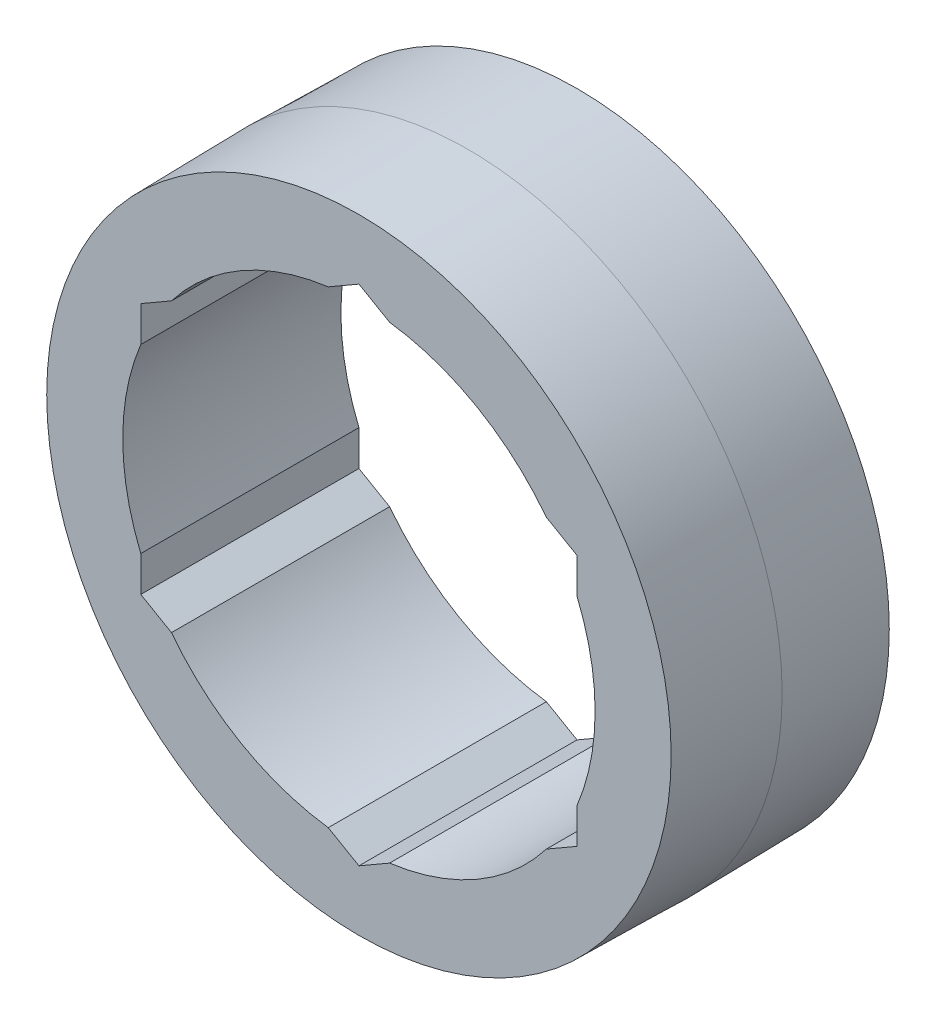
ISO-10303-21;
HEADER;
FILE_DESCRIPTION(('STEP AP214'),'2;1');
FILE_NAME('part.step','',(''),(''),'','','');
FILE_SCHEMA(('AUTOMOTIVE_DESIGN { 1 0 10303 214 1 1 1 1 }'));
ENDSEC;
DATA;
#1=APPLICATION_CONTEXT('core data for automotive mechanical design processes');
#2=APPLICATION_PROTOCOL_DEFINITION('international standard','automotive_design',2000,#1);
#3=PRODUCT_CONTEXT('',#1,'mechanical');
#4=PRODUCT('Part','Part','',(#3));
#5=PRODUCT_RELATED_PRODUCT_CATEGORY('part','',(#4));
#6=PRODUCT_DEFINITION_FORMATION('','',#4);
#7=PRODUCT_DEFINITION_CONTEXT('part definition',#1,'design');
#8=PRODUCT_DEFINITION('design','',#6,#7);
#9=PRODUCT_DEFINITION_SHAPE('','',#8);
#10=(LENGTH_UNIT() NAMED_UNIT(*) SI_UNIT(.MILLI.,.METRE.));
#11=(NAMED_UNIT(*) PLANE_ANGLE_UNIT() SI_UNIT($,.RADIAN.));
#12=(NAMED_UNIT(*) SI_UNIT($,.STERADIAN.) SOLID_ANGLE_UNIT());
#13=UNCERTAINTY_MEASURE_WITH_UNIT(LENGTH_MEASURE(1.E-05),#10,'distance_accuracy_value','');
#14=(GEOMETRIC_REPRESENTATION_CONTEXT(3) GLOBAL_UNCERTAINTY_ASSIGNED_CONTEXT((#13)) GLOBAL_UNIT_ASSIGNED_CONTEXT((#10,
#11,#12)) REPRESENTATION_CONTEXT('',''));
#15=CARTESIAN_POINT('',(0.,0.,0.));
#16=DIRECTION('',(0.,0.,1.));
#17=DIRECTION('',(1.,0.,0.));
#18=AXIS2_PLACEMENT_3D('',#15,#16,#17);
#19=CARTESIAN_POINT('',(6.35,0.,3.175));
#20=DIRECTION('',(-1.,0.,0.));
#21=DIRECTION('',(0.,-1.,0.));
#22=AXIS2_PLACEMENT_3D('',#19,#20,#21);
#23=PLANE('',#22);
#24=DIRECTION('',(0.,1.,0.));
#25=VECTOR('',#24,1.);
#26=CARTESIAN_POINT('',(6.35,0.,3.175));
#27=LINE('',#26,#25);
#28=CARTESIAN_POINT('',(6.35,3.66617420935413,3.175));
#29=VERTEX_POINT('',#28);
#30=CARTESIAN_POINT('',(6.35,2.6349809358893,3.175));
#31=VERTEX_POINT('',#30);
#32=EDGE_CURVE('E124',#29,#31,#27,.F.);
#33=ORIENTED_EDGE('',*,*,#32,.F.);
#34=DIRECTION('',(0.,0.,1.));
#35=VECTOR('',#34,1.);
#36=CARTESIAN_POINT('',(6.35,3.66617420935413,3.175));
#37=LINE('',#36,#35);
#38=CARTESIAN_POINT('',(6.35,3.66617420935413,-3.175));
#39=VERTEX_POINT('',#38);
#40=EDGE_CURVE('E133',#39,#29,#37,.T.);
#41=ORIENTED_EDGE('',*,*,#40,.F.);
#42=DIRECTION('',(0.,-1.,0.));
#43=VECTOR('',#42,1.);
#44=CARTESIAN_POINT('',(6.35,0.,-3.175));
#45=LINE('',#44,#43);
#46=CARTESIAN_POINT('',(6.35,2.6349809358893,-3.175));
#47=VERTEX_POINT('',#46);
#48=EDGE_CURVE('E183',#39,#47,#45,.T.);
#49=ORIENTED_EDGE('',*,*,#48,.T.);
#50=DIRECTION('',(0.,0.,-1.));
#51=VECTOR('',#50,1.);
#52=CARTESIAN_POINT('',(6.35,2.6349809358893,3.175));
#53=LINE('',#52,#51);
#54=EDGE_CURVE('E293',#47,#31,#53,.F.);
#55=ORIENTED_EDGE('',*,*,#54,.T.);
#56=EDGE_LOOP('',(#33,#41,#49,#55));
#57=FACE_BOUND('',#56,.T.);
#58=ADVANCED_FACE('F17',(#57),#23,.T.);
#59=CARTESIAN_POINT('',(6.35,0.,3.175));
#60=DIRECTION('',(-1.,0.,0.));
#61=DIRECTION('',(0.,-1.,0.));
#62=AXIS2_PLACEMENT_3D('',#59,#60,#61);
#63=PLANE('',#62);
#64=DIRECTION('',(0.,1.,0.));
#65=VECTOR('',#64,1.);
#66=CARTESIAN_POINT('',(6.35,0.,3.175));
#67=LINE('',#66,#65);
#68=CARTESIAN_POINT('',(6.35,-2.6349809358893,3.175));
#69=VERTEX_POINT('',#68);
#70=CARTESIAN_POINT('',(6.35,-3.66617420935413,3.175));
#71=VERTEX_POINT('',#70);
#72=EDGE_CURVE('E354',#69,#71,#67,.F.);
#73=ORIENTED_EDGE('',*,*,#72,.F.);
#74=DIRECTION('',(0.,0.,-1.));
#75=VECTOR('',#74,1.);
#76=CARTESIAN_POINT('',(6.35,-2.63498093588929,3.175));
#77=LINE('',#76,#75);
#78=CARTESIAN_POINT('',(6.35,-2.63498093588929,-3.175));
#79=VERTEX_POINT('',#78);
#80=EDGE_CURVE('E176',#69,#79,#77,.T.);
#81=ORIENTED_EDGE('',*,*,#80,.T.);
#82=DIRECTION('',(0.,-1.,0.));
#83=VECTOR('',#82,1.);
#84=CARTESIAN_POINT('',(6.35,0.,-3.175));
#85=LINE('',#84,#83);
#86=CARTESIAN_POINT('',(6.35,-3.66617420935413,-3.175));
#87=VERTEX_POINT('',#86);
#88=EDGE_CURVE('E170',#79,#87,#85,.T.);
#89=ORIENTED_EDGE('',*,*,#88,.T.);
#90=DIRECTION('',(0.,0.,1.));
#91=VECTOR('',#90,1.);
#92=CARTESIAN_POINT('',(6.35,-3.66617420935413,3.175));
#93=LINE('',#92,#91);
#94=EDGE_CURVE('E173',#71,#87,#93,.F.);
#95=ORIENTED_EDGE('',*,*,#94,.F.);
#96=EDGE_LOOP('',(#73,#81,#89,#95));
#97=FACE_BOUND('',#96,.T.);
#98=ADVANCED_FACE('F172',(#97),#63,.T.);
#99=CARTESIAN_POINT('',(3.175,-5.49926131403119,3.175));
#100=DIRECTION('',(-0.5,0.866025403784439,0.));
#101=DIRECTION('',(-0.866025403784439,-0.5,0.));
#102=AXIS2_PLACEMENT_3D('',#99,#100,#101);
#103=PLANE('',#102);
#104=DIRECTION('',(-0.866025403784438,-0.500000000000001,0.));
#105=VECTOR('',#104,1.);
#106=CARTESIAN_POINT('',(6.35,-3.66617420935413,3.175));
#107=LINE('',#106,#105);
#108=CARTESIAN_POINT('',(5.45696042896782,-4.18177084608654,3.175));
#109=VERTEX_POINT('',#108);
#110=EDGE_CURVE('E189',#71,#109,#107,.T.);
#111=ORIENTED_EDGE('',*,*,#110,.F.);
#112=ORIENTED_EDGE('',*,*,#94,.T.);
#113=DIRECTION('',(-0.866025403784439,-0.5,0.));
#114=VECTOR('',#113,1.);
#115=CARTESIAN_POINT('',(3.175,-5.49926131403119,-3.175));
#116=LINE('',#115,#114);
#117=CARTESIAN_POINT('',(5.45696042896782,-4.18177084608654,-3.175));
#118=VERTEX_POINT('',#117);
#119=EDGE_CURVE('E182',#87,#118,#116,.T.);
#120=ORIENTED_EDGE('',*,*,#119,.T.);
#121=DIRECTION('',(0.,0.,-1.));
#122=VECTOR('',#121,1.);
#123=CARTESIAN_POINT('',(5.45696042896782,-4.18177084608654,3.175));
#124=LINE('',#123,#122);
#125=EDGE_CURVE('E290',#118,#109,#124,.F.);
#126=ORIENTED_EDGE('',*,*,#125,.T.);
#127=EDGE_LOOP('',(#111,#112,#120,#126));
#128=FACE_BOUND('',#127,.T.);
#129=ADVANCED_FACE('F186',(#128),#103,.T.);
#130=CARTESIAN_POINT('',(3.175,-5.49926131403119,3.175));
#131=DIRECTION('',(-0.5,0.866025403784439,0.));
#132=DIRECTION('',(-0.866025403784439,-0.5,0.));
#133=AXIS2_PLACEMENT_3D('',#130,#131,#132);
#134=PLANE('',#133);
#135=DIRECTION('',(-0.866025403784439,-0.499999999999998,0.));
#136=VECTOR('',#135,1.);
#137=CARTESIAN_POINT('',(0.893039571032181,-6.81675178197583,3.175));
#138=LINE('',#137,#136);
#139=CARTESIAN_POINT('',(0.893039571032182,-6.81675178197583,3.175));
#140=VERTEX_POINT('',#139);
#141=CARTESIAN_POINT('',(0.,-7.33234841870825,3.175));
#142=VERTEX_POINT('',#141);
#143=EDGE_CURVE('E346',#140,#142,#138,.T.);
#144=ORIENTED_EDGE('',*,*,#143,.F.);
#145=DIRECTION('',(0.,0.,-1.));
#146=VECTOR('',#145,1.);
#147=CARTESIAN_POINT('',(0.893039571032185,-6.81675178197583,3.175));
#148=LINE('',#147,#146);
#149=CARTESIAN_POINT('',(0.893039571032183,-6.81675178197583,-3.175));
#150=VERTEX_POINT('',#149);
#151=EDGE_CURVE('E289',#140,#150,#148,.T.);
#152=ORIENTED_EDGE('',*,*,#151,.T.);
#153=DIRECTION('',(-0.866025403784439,-0.5,0.));
#154=VECTOR('',#153,1.);
#155=CARTESIAN_POINT('',(3.175,-5.49926131403119,-3.175));
#156=LINE('',#155,#154);
#157=CARTESIAN_POINT('',(0.,-7.33234841870825,-3.175));
#158=VERTEX_POINT('',#157);
#159=EDGE_CURVE('E191',#150,#158,#156,.T.);
#160=ORIENTED_EDGE('',*,*,#159,.T.);
#161=DIRECTION('',(0.,0.,1.));
#162=VECTOR('',#161,1.);
#163=CARTESIAN_POINT('',(0.,-7.33234841870825,3.175));
#164=LINE('',#163,#162);
#165=EDGE_CURVE('E238',#142,#158,#164,.F.);
#166=ORIENTED_EDGE('',*,*,#165,.F.);
#167=EDGE_LOOP('',(#144,#152,#160,#166));
#168=FACE_BOUND('',#167,.T.);
#169=ADVANCED_FACE('F389',(#168),#134,.T.);
#170=CARTESIAN_POINT('',(-3.175,-5.49926131403119,3.175));
#171=DIRECTION('',(0.5,0.866025403784439,0.));
#172=DIRECTION('',(-0.866025403784439,0.5,0.));
#173=AXIS2_PLACEMENT_3D('',#170,#171,#172);
#174=PLANE('',#173);
#175=DIRECTION('',(-0.86602540378444,0.499999999999998,0.));
#176=VECTOR('',#175,1.);
#177=CARTESIAN_POINT('',(0.,-7.33234841870825,3.175));
#178=LINE('',#177,#176);
#179=CARTESIAN_POINT('',(-0.893039571032187,-6.81675178197583,3.175));
#180=VERTEX_POINT('',#179);
#181=EDGE_CURVE('E342',#142,#180,#178,.T.);
#182=ORIENTED_EDGE('',*,*,#181,.F.);
#183=ORIENTED_EDGE('',*,*,#165,.T.);
#184=DIRECTION('',(-0.866025403784439,0.5,0.));
#185=VECTOR('',#184,1.);
#186=CARTESIAN_POINT('',(-3.175,-5.49926131403119,-3.175));
#187=LINE('',#186,#185);
#188=CARTESIAN_POINT('',(-0.893039571032187,-6.81675178197583,-3.175));
#189=VERTEX_POINT('',#188);
#190=EDGE_CURVE('E242',#158,#189,#187,.T.);
#191=ORIENTED_EDGE('',*,*,#190,.T.);
#192=DIRECTION('',(0.,0.,-1.));
#193=VECTOR('',#192,1.);
#194=CARTESIAN_POINT('',(-0.893039571032188,-6.81675178197583,3.175));
#195=LINE('',#194,#193);
#196=EDGE_CURVE('E285',#189,#180,#195,.F.);
#197=ORIENTED_EDGE('',*,*,#196,.T.);
#198=EDGE_LOOP('',(#182,#183,#191,#197));
#199=FACE_BOUND('',#198,.T.);
#200=ADVANCED_FACE('F394',(#199),#174,.T.);
#201=CARTESIAN_POINT('',(-3.175,-5.49926131403119,3.175));
#202=DIRECTION('',(0.5,0.866025403784439,0.));
#203=DIRECTION('',(-0.866025403784439,0.5,0.));
#204=AXIS2_PLACEMENT_3D('',#201,#202,#203);
#205=PLANE('',#204);
#206=DIRECTION('',(-0.866025403784437,0.500000000000002,0.));
#207=VECTOR('',#206,1.);
#208=CARTESIAN_POINT('',(-5.45696042896782,-4.18177084608655,3.175));
#209=LINE('',#208,#207);
#210=CARTESIAN_POINT('',(-5.45696042896782,-4.18177084608655,3.175));
#211=VERTEX_POINT('',#210);
#212=CARTESIAN_POINT('',(-6.35,-3.66617420935412,3.175));
#213=VERTEX_POINT('',#212);
#214=EDGE_CURVE('E338',#211,#213,#209,.T.);
#215=ORIENTED_EDGE('',*,*,#214,.F.);
#216=DIRECTION('',(0.,0.,-1.));
#217=VECTOR('',#216,1.);
#218=CARTESIAN_POINT('',(-5.45696042896782,-4.18177084608655,3.175));
#219=LINE('',#218,#217);
#220=CARTESIAN_POINT('',(-5.45696042896782,-4.18177084608655,-3.175));
#221=VERTEX_POINT('',#220);
#222=EDGE_CURVE('E284',#211,#221,#219,.T.);
#223=ORIENTED_EDGE('',*,*,#222,.T.);
#224=DIRECTION('',(-0.866025403784439,0.5,0.));
#225=VECTOR('',#224,1.);
#226=CARTESIAN_POINT('',(-3.175,-5.49926131403119,-3.175));
#227=LINE('',#226,#225);
#228=CARTESIAN_POINT('',(-6.35,-3.66617420935412,-3.175));
#229=VERTEX_POINT('',#228);
#230=EDGE_CURVE('E241',#221,#229,#227,.T.);
#231=ORIENTED_EDGE('',*,*,#230,.T.);
#232=DIRECTION('',(0.,0.,1.));
#233=VECTOR('',#232,1.);
#234=CARTESIAN_POINT('',(-6.35,-3.66617420935412,3.175));
#235=LINE('',#234,#233);
#236=EDGE_CURVE('E231',#213,#229,#235,.F.);
#237=ORIENTED_EDGE('',*,*,#236,.F.);
#238=EDGE_LOOP('',(#215,#223,#231,#237));
#239=FACE_BOUND('',#238,.T.);
#240=ADVANCED_FACE('F439',(#239),#205,.T.);
#241=CARTESIAN_POINT('',(-6.35,0.,3.175));
#242=DIRECTION('',(1.,0.,0.));
#243=DIRECTION('',(0.,1.,0.));
#244=AXIS2_PLACEMENT_3D('',#241,#242,#243);
#245=PLANE('',#244);
#246=DIRECTION('',(0.,1.,0.));
#247=VECTOR('',#246,1.);
#248=CARTESIAN_POINT('',(-6.35,0.,3.175));
#249=LINE('',#248,#247);
#250=CARTESIAN_POINT('',(-6.35,-2.63498093588928,3.175));
#251=VERTEX_POINT('',#250);
#252=EDGE_CURVE('E333',#213,#251,#249,.T.);
#253=ORIENTED_EDGE('',*,*,#252,.F.);
#254=ORIENTED_EDGE('',*,*,#236,.T.);
#255=DIRECTION('',(0.,1.,0.));
#256=VECTOR('',#255,1.);
#257=CARTESIAN_POINT('',(-6.35,0.,-3.175));
#258=LINE('',#257,#256);
#259=CARTESIAN_POINT('',(-6.35,-2.63498093588928,-3.175));
#260=VERTEX_POINT('',#259);
#261=EDGE_CURVE('E235',#229,#260,#258,.T.);
#262=ORIENTED_EDGE('',*,*,#261,.T.);
#263=DIRECTION('',(0.,0.,-1.));
#264=VECTOR('',#263,1.);
#265=CARTESIAN_POINT('',(-6.35,-2.63498093588928,3.175));
#266=LINE('',#265,#264);
#267=EDGE_CURVE('E433',#260,#251,#266,.F.);
#268=ORIENTED_EDGE('',*,*,#267,.T.);
#269=EDGE_LOOP('',(#253,#254,#262,#268));
#270=FACE_BOUND('',#269,.T.);
#271=ADVANCED_FACE('F441',(#270),#245,.T.);
#272=CARTESIAN_POINT('',(-6.35,0.,3.175));
#273=DIRECTION('',(1.,0.,0.));
#274=DIRECTION('',(0.,1.,0.));
#275=AXIS2_PLACEMENT_3D('',#272,#273,#274);
#276=PLANE('',#275);
#277=DIRECTION('',(0.,1.,0.));
#278=VECTOR('',#277,1.);
#279=CARTESIAN_POINT('',(-6.35,0.,3.175));
#280=LINE('',#279,#278);
#281=CARTESIAN_POINT('',(-6.35,2.63498093588928,3.175));
#282=VERTEX_POINT('',#281);
#283=CARTESIAN_POINT('',(-6.35,3.66617420935413,3.175));
#284=VERTEX_POINT('',#283);
#285=EDGE_CURVE('E329',#282,#284,#280,.T.);
#286=ORIENTED_EDGE('',*,*,#285,.F.);
#287=DIRECTION('',(0.,0.,-1.));
#288=VECTOR('',#287,1.);
#289=CARTESIAN_POINT('',(-6.35,2.63498093588928,3.175));
#290=LINE('',#289,#288);
#291=CARTESIAN_POINT('',(-6.35,2.63498093588929,-3.175));
#292=VERTEX_POINT('',#291);
#293=EDGE_CURVE('E280',#282,#292,#290,.T.);
#294=ORIENTED_EDGE('',*,*,#293,.T.);
#295=DIRECTION('',(0.,1.,0.));
#296=VECTOR('',#295,1.);
#297=CARTESIAN_POINT('',(-6.35,0.,-3.175));
#298=LINE('',#297,#296);
#299=CARTESIAN_POINT('',(-6.35,3.66617420935413,-3.175));
#300=VERTEX_POINT('',#299);
#301=EDGE_CURVE('E234',#292,#300,#298,.T.);
#302=ORIENTED_EDGE('',*,*,#301,.T.);
#303=DIRECTION('',(0.,0.,1.));
#304=VECTOR('',#303,1.);
#305=CARTESIAN_POINT('',(-6.35,3.66617420935413,3.175));
#306=LINE('',#305,#304);
#307=EDGE_CURVE('E224',#284,#300,#306,.F.);
#308=ORIENTED_EDGE('',*,*,#307,.F.);
#309=EDGE_LOOP('',(#286,#294,#302,#308));
#310=FACE_BOUND('',#309,.T.);
#311=ADVANCED_FACE('F450',(#310),#276,.T.);
#312=CARTESIAN_POINT('',(-3.175,5.49926131403119,3.175));
#313=DIRECTION('',(0.5,-0.866025403784439,0.));
#314=DIRECTION('',(0.866025403784439,0.5,0.));
#315=AXIS2_PLACEMENT_3D('',#312,#313,#314);
#316=PLANE('',#315);
#317=DIRECTION('',(0.866025403784438,0.5,0.));
#318=VECTOR('',#317,1.);
#319=CARTESIAN_POINT('',(-6.35,3.66617420935413,3.175));
#320=LINE('',#319,#318);
#321=CARTESIAN_POINT('',(-5.45696042896781,4.18177084608655,3.175));
#322=VERTEX_POINT('',#321);
#323=EDGE_CURVE('E325',#284,#322,#320,.T.);
#324=ORIENTED_EDGE('',*,*,#323,.F.);
#325=ORIENTED_EDGE('',*,*,#307,.T.);
#326=DIRECTION('',(0.866025403784439,0.5,0.));
#327=VECTOR('',#326,1.);
#328=CARTESIAN_POINT('',(-3.175,5.49926131403119,-3.175));
#329=LINE('',#328,#327);
#330=CARTESIAN_POINT('',(-5.45696042896781,4.18177084608655,-3.175));
#331=VERTEX_POINT('',#330);
#332=EDGE_CURVE('E228',#300,#331,#329,.T.);
#333=ORIENTED_EDGE('',*,*,#332,.T.);
#334=DIRECTION('',(0.,0.,-1.));
#335=VECTOR('',#334,1.);
#336=CARTESIAN_POINT('',(-5.45696042896781,4.18177084608655,3.175));
#337=LINE('',#336,#335);
#338=EDGE_CURVE('E276',#331,#322,#337,.F.);
#339=ORIENTED_EDGE('',*,*,#338,.T.);
#340=EDGE_LOOP('',(#324,#325,#333,#339));
#341=FACE_BOUND('',#340,.T.);
#342=ADVANCED_FACE('F459',(#341),#316,.T.);
#343=CARTESIAN_POINT('',(-3.175,5.49926131403119,3.175));
#344=DIRECTION('',(0.5,-0.866025403784439,0.));
#345=DIRECTION('',(0.866025403784439,0.5,0.));
#346=AXIS2_PLACEMENT_3D('',#343,#344,#345);
#347=PLANE('',#346);
#348=DIRECTION('',(0.866025403784439,0.499999999999999,0.));
#349=VECTOR('',#348,1.);
#350=CARTESIAN_POINT('',(-0.893039571032188,6.81675178197583,3.175));
#351=LINE('',#350,#349);
#352=CARTESIAN_POINT('',(-0.89303957103219,6.81675178197583,3.175));
#353=VERTEX_POINT('',#352);
#354=CARTESIAN_POINT('',(0.,7.33234841870825,3.175));
#355=VERTEX_POINT('',#354);
#356=EDGE_CURVE('E320',#353,#355,#351,.T.);
#357=ORIENTED_EDGE('',*,*,#356,.F.);
#358=DIRECTION('',(0.,0.,-1.));
#359=VECTOR('',#358,1.);
#360=CARTESIAN_POINT('',(-0.893039571032188,6.81675178197583,3.175));
#361=LINE('',#360,#359);
#362=CARTESIAN_POINT('',(-0.893039571032188,6.81675178197583,-3.175));
#363=VERTEX_POINT('',#362);
#364=EDGE_CURVE('E275',#353,#363,#361,.T.);
#365=ORIENTED_EDGE('',*,*,#364,.T.);
#366=DIRECTION('',(0.866025403784439,0.5,0.));
#367=VECTOR('',#366,1.);
#368=CARTESIAN_POINT('',(-3.175,5.49926131403119,-3.175));
#369=LINE('',#368,#367);
#370=CARTESIAN_POINT('',(0.,7.33234841870825,-3.175));
#371=VERTEX_POINT('',#370);
#372=EDGE_CURVE('E227',#363,#371,#369,.T.);
#373=ORIENTED_EDGE('',*,*,#372,.T.);
#374=DIRECTION('',(0.,0.,1.));
#375=VECTOR('',#374,1.);
#376=CARTESIAN_POINT('',(0.,7.33234841870825,3.175));
#377=LINE('',#376,#375);
#378=EDGE_CURVE('E219',#355,#371,#377,.F.);
#379=ORIENTED_EDGE('',*,*,#378,.F.);
#380=EDGE_LOOP('',(#357,#365,#373,#379));
#381=FACE_BOUND('',#380,.T.);
#382=ADVANCED_FACE('F462',(#381),#347,.T.);
#383=CARTESIAN_POINT('',(3.175,5.49926131403119,3.175));
#384=DIRECTION('',(-0.5,-0.866025403784439,0.));
#385=DIRECTION('',(0.866025403784439,-0.5,0.));
#386=AXIS2_PLACEMENT_3D('',#383,#384,#385);
#387=PLANE('',#386);
#388=DIRECTION('',(0.866025403784439,-0.499999999999999,0.));
#389=VECTOR('',#388,1.);
#390=CARTESIAN_POINT('',(0.,7.33234841870825,3.175));
#391=LINE('',#390,#389);
#392=CARTESIAN_POINT('',(0.89303957103219,6.81675178197583,3.175));
#393=VERTEX_POINT('',#392);
#394=EDGE_CURVE('E311',#355,#393,#391,.T.);
#395=ORIENTED_EDGE('',*,*,#394,.F.);
#396=ORIENTED_EDGE('',*,*,#378,.T.);
#397=DIRECTION('',(0.866025403784439,-0.5,0.));
#398=VECTOR('',#397,1.);
#399=CARTESIAN_POINT('',(3.175,5.49926131403119,-3.175));
#400=LINE('',#399,#398);
#401=CARTESIAN_POINT('',(0.893039571032187,6.81675178197583,-3.175));
#402=VERTEX_POINT('',#401);
#403=EDGE_CURVE('E40',#371,#402,#400,.T.);
#404=ORIENTED_EDGE('',*,*,#403,.T.);
#405=DIRECTION('',(0.,0.,-1.));
#406=VECTOR('',#405,1.);
#407=CARTESIAN_POINT('',(0.893039571032189,6.81675178197583,3.175));
#408=LINE('',#407,#406);
#409=EDGE_CURVE('E270',#402,#393,#408,.F.);
#410=ORIENTED_EDGE('',*,*,#409,.T.);
#411=EDGE_LOOP('',(#395,#396,#404,#410));
#412=FACE_BOUND('',#411,.T.);
#413=ADVANCED_FACE('F464',(#412),#387,.T.);
#414=CARTESIAN_POINT('',(0.,0.,3.175));
#415=DIRECTION('',(0.,0.,1.));
#416=DIRECTION('',(1.,0.,0.));
#417=AXIS2_PLACEMENT_3D('',#414,#415,#416);
#418=PLANE('',#417);
#419=CARTESIAN_POINT('',(0.,0.,3.17500000000004));
#420=DIRECTION('',(0.,0.,-1.));
#421=DIRECTION('',(-1.,0.,0.));
#422=AXIS2_PLACEMENT_3D('',#419,#420,#421);
#423=CIRCLE('',#422,9.08858016885291);
#424=CARTESIAN_POINT('',(-9.08858016885291,0.,3.17500000000004));
#425=VERTEX_POINT('',#424);
#426=EDGE_CURVE('E20',#425,#425,#423,.T.);
#427=ORIENTED_EDGE('',*,*,#426,.F.);
#428=EDGE_LOOP('',(#427));
#429=FACE_BOUND('',#428,.T.);
#430=ORIENTED_EDGE('',*,*,#356,.T.);
#431=ORIENTED_EDGE('',*,*,#394,.T.);
#432=CARTESIAN_POINT('',(0.,0.,3.175));
#433=DIRECTION('',(0.,0.,-1.));
#434=DIRECTION('',(-1.,0.,0.));
#435=AXIS2_PLACEMENT_3D('',#432,#433,#434);
#436=CIRCLE('',#435,6.874999966);
#437=CARTESIAN_POINT('',(5.45696042896782,4.18177084608655,3.175));
#438=VERTEX_POINT('',#437);
#439=EDGE_CURVE('E265',#393,#438,#436,.T.);
#440=ORIENTED_EDGE('',*,*,#439,.T.);
#441=DIRECTION('',(0.866025403784439,-0.5,0.));
#442=VECTOR('',#441,1.);
#443=CARTESIAN_POINT('',(3.175,5.49926131403119,3.175));
#444=LINE('',#443,#442);
#445=EDGE_CURVE('E215',#29,#438,#444,.F.);
#446=ORIENTED_EDGE('',*,*,#445,.F.);
#447=ORIENTED_EDGE('',*,*,#32,.T.);
#448=CARTESIAN_POINT('',(0.,0.,3.175));
#449=DIRECTION('',(0.,0.,-1.));
#450=DIRECTION('',(-1.,0.,0.));
#451=AXIS2_PLACEMENT_3D('',#448,#449,#450);
#452=CIRCLE('',#451,6.874999966);
#453=EDGE_CURVE('E291',#31,#69,#452,.T.);
#454=ORIENTED_EDGE('',*,*,#453,.T.);
#455=ORIENTED_EDGE('',*,*,#72,.T.);
#456=ORIENTED_EDGE('',*,*,#110,.T.);
#457=CARTESIAN_POINT('',(0.,0.,3.175));
#458=DIRECTION('',(0.,0.,-1.));
#459=DIRECTION('',(-1.,0.,0.));
#460=AXIS2_PLACEMENT_3D('',#457,#458,#459);
#461=CIRCLE('',#460,6.874999966);
#462=EDGE_CURVE('E286',#109,#140,#461,.T.);
#463=ORIENTED_EDGE('',*,*,#462,.T.);
#464=ORIENTED_EDGE('',*,*,#143,.T.);
#465=ORIENTED_EDGE('',*,*,#181,.T.);
#466=CARTESIAN_POINT('',(0.,0.,3.175));
#467=DIRECTION('',(0.,0.,-1.));
#468=DIRECTION('',(-1.,0.,0.));
#469=AXIS2_PLACEMENT_3D('',#466,#467,#468);
#470=CIRCLE('',#469,6.874999966);
#471=EDGE_CURVE('E281',#180,#211,#470,.T.);
#472=ORIENTED_EDGE('',*,*,#471,.T.);
#473=ORIENTED_EDGE('',*,*,#214,.T.);
#474=ORIENTED_EDGE('',*,*,#252,.T.);
#475=CARTESIAN_POINT('',(0.,0.,3.175));
#476=DIRECTION('',(0.,0.,-1.));
#477=DIRECTION('',(-1.,0.,0.));
#478=AXIS2_PLACEMENT_3D('',#475,#476,#477);
#479=CIRCLE('',#478,6.874999966);
#480=EDGE_CURVE('E277',#251,#282,#479,.T.);
#481=ORIENTED_EDGE('',*,*,#480,.T.);
#482=ORIENTED_EDGE('',*,*,#285,.T.);
#483=ORIENTED_EDGE('',*,*,#323,.T.);
#484=CARTESIAN_POINT('',(0.,0.,3.175));
#485=DIRECTION('',(0.,0.,-1.));
#486=DIRECTION('',(-1.,0.,0.));
#487=AXIS2_PLACEMENT_3D('',#484,#485,#486);
#488=CIRCLE('',#487,6.874999966);
#489=EDGE_CURVE('E271',#322,#353,#488,.T.);
#490=ORIENTED_EDGE('',*,*,#489,.T.);
#491=EDGE_LOOP('',(#430,#431,#440,#446,#447,#454,#455,#456,#463,#464,#465,#472,#473,#474,#481,
#482,#483,#490));
#492=FACE_BOUND('',#491,.T.);
#493=ADVANCED_FACE('F411',(#429,#492),#418,.T.);
#494=CARTESIAN_POINT('',(3.175,5.49926131403119,3.175));
#495=DIRECTION('',(-0.5,-0.866025403784439,0.));
#496=DIRECTION('',(0.866025403784439,-0.5,0.));
#497=AXIS2_PLACEMENT_3D('',#494,#495,#496);
#498=PLANE('',#497);
#499=ORIENTED_EDGE('',*,*,#445,.T.);
#500=DIRECTION('',(0.,0.,-1.));
#501=VECTOR('',#500,1.);
#502=CARTESIAN_POINT('',(5.45696042896781,4.18177084608655,3.175));
#503=LINE('',#502,#501);
#504=CARTESIAN_POINT('',(5.45696042896782,4.18177084608655,-3.175));
#505=VERTEX_POINT('',#504);
#506=EDGE_CURVE('E269',#438,#505,#503,.T.);
#507=ORIENTED_EDGE('',*,*,#506,.T.);
#508=DIRECTION('',(0.866025403784439,-0.5,0.));
#509=VECTOR('',#508,1.);
#510=CARTESIAN_POINT('',(3.175,5.49926131403119,-3.175));
#511=LINE('',#510,#509);
#512=EDGE_CURVE('E216',#505,#39,#511,.T.);
#513=ORIENTED_EDGE('',*,*,#512,.T.);
#514=ORIENTED_EDGE('',*,*,#40,.T.);
#515=EDGE_LOOP('',(#499,#507,#513,#514));
#516=FACE_BOUND('',#515,.T.);
#517=ADVANCED_FACE('F419',(#516),#498,.T.);
#518=CARTESIAN_POINT('',(0.,0.,0.));
#519=DIRECTION('',(0.,0.,-1.));
#520=DIRECTION('',(-1.,0.,0.));
#521=AXIS2_PLACEMENT_3D('',#518,#519,#520);
#522=CONICAL_SURFACE('',#521,9.144,0.0174532925199435);
#523=CARTESIAN_POINT('',(0.,0.,0.));
#524=DIRECTION('',(0.,0.,1.));
#525=DIRECTION('',(-1.,0.,0.));
#526=AXIS2_PLACEMENT_3D('',#523,#524,#525);
#527=CIRCLE('',#526,9.144);
#528=CARTESIAN_POINT('',(-9.144,0.,0.));
#529=VERTEX_POINT('',#528);
#530=EDGE_CURVE('E264',#529,#529,#527,.F.);
#531=ORIENTED_EDGE('',*,*,#530,.F.);
#532=EDGE_LOOP('',(#531));
#533=FACE_BOUND('',#532,.T.);
#534=ORIENTED_EDGE('',*,*,#426,.T.);
#535=EDGE_LOOP('',(#534));
#536=FACE_BOUND('',#535,.T.);
#537=ADVANCED_FACE('F498',(#533,#536),#522,.T.);
#538=CARTESIAN_POINT('',(0.,0.,3.175));
#539=DIRECTION('',(0.,0.,-1.));
#540=DIRECTION('',(-1.,0.,0.));
#541=AXIS2_PLACEMENT_3D('',#538,#539,#540);
#542=CYLINDRICAL_SURFACE('',#541,6.874999966);
#543=ORIENTED_EDGE('',*,*,#80,.F.);
#544=ORIENTED_EDGE('',*,*,#453,.F.);
#545=ORIENTED_EDGE('',*,*,#54,.F.);
#546=CARTESIAN_POINT('',(0.,0.,-3.175));
#547=DIRECTION('',(0.,0.,-1.));
#548=DIRECTION('',(-1.,0.,0.));
#549=AXIS2_PLACEMENT_3D('',#546,#547,#548);
#550=CIRCLE('',#549,6.874999966);
#551=EDGE_CURVE('E261',#47,#79,#550,.T.);
#552=ORIENTED_EDGE('',*,*,#551,.T.);
#553=EDGE_LOOP('',(#543,#544,#545,#552));
#554=FACE_BOUND('',#553,.T.);
#555=ADVANCED_FACE('F413',(#554),#542,.F.);
#556=CARTESIAN_POINT('',(0.,0.,3.175));
#557=DIRECTION('',(0.,0.,-1.));
#558=DIRECTION('',(-1.,0.,0.));
#559=AXIS2_PLACEMENT_3D('',#556,#557,#558);
#560=CYLINDRICAL_SURFACE('',#559,6.874999966);
#561=ORIENTED_EDGE('',*,*,#151,.F.);
#562=ORIENTED_EDGE('',*,*,#462,.F.);
#563=ORIENTED_EDGE('',*,*,#125,.F.);
#564=CARTESIAN_POINT('',(0.,0.,-3.175));
#565=DIRECTION('',(0.,0.,-1.));
#566=DIRECTION('',(-1.,0.,0.));
#567=AXIS2_PLACEMENT_3D('',#564,#565,#566);
#568=CIRCLE('',#567,6.874999966);
#569=EDGE_CURVE('E196',#118,#150,#568,.T.);
#570=ORIENTED_EDGE('',*,*,#569,.T.);
#571=EDGE_LOOP('',(#561,#562,#563,#570));
#572=FACE_BOUND('',#571,.T.);
#573=ADVANCED_FACE('F410',(#572),#560,.F.);
#574=CARTESIAN_POINT('',(0.,0.,3.175));
#575=DIRECTION('',(0.,0.,-1.));
#576=DIRECTION('',(-1.,0.,0.));
#577=AXIS2_PLACEMENT_3D('',#574,#575,#576);
#578=CYLINDRICAL_SURFACE('',#577,6.874999966);
#579=ORIENTED_EDGE('',*,*,#222,.F.);
#580=ORIENTED_EDGE('',*,*,#471,.F.);
#581=ORIENTED_EDGE('',*,*,#196,.F.);
#582=CARTESIAN_POINT('',(0.,0.,-3.175));
#583=DIRECTION('',(0.,0.,-1.));
#584=DIRECTION('',(-1.,0.,0.));
#585=AXIS2_PLACEMENT_3D('',#582,#583,#584);
#586=CIRCLE('',#585,6.874999966);
#587=EDGE_CURVE('E256',#189,#221,#586,.T.);
#588=ORIENTED_EDGE('',*,*,#587,.T.);
#589=EDGE_LOOP('',(#579,#580,#581,#588));
#590=FACE_BOUND('',#589,.T.);
#591=ADVANCED_FACE('F402',(#590),#578,.F.);
#592=CARTESIAN_POINT('',(0.,0.,3.175));
#593=DIRECTION('',(0.,0.,-1.));
#594=DIRECTION('',(-1.,0.,0.));
#595=AXIS2_PLACEMENT_3D('',#592,#593,#594);
#596=CYLINDRICAL_SURFACE('',#595,6.874999966);
#597=ORIENTED_EDGE('',*,*,#480,.F.);
#598=ORIENTED_EDGE('',*,*,#267,.F.);
#599=CARTESIAN_POINT('',(0.,0.,-3.175));
#600=DIRECTION('',(0.,0.,-1.));
#601=DIRECTION('',(-1.,0.,0.));
#602=AXIS2_PLACEMENT_3D('',#599,#600,#601);
#603=CIRCLE('',#602,6.874999966);
#604=EDGE_CURVE('E254',#260,#292,#603,.T.);
#605=ORIENTED_EDGE('',*,*,#604,.T.);
#606=ORIENTED_EDGE('',*,*,#293,.F.);
#607=EDGE_LOOP('',(#597,#598,#605,#606));
#608=FACE_BOUND('',#607,.T.);
#609=ADVANCED_FACE('F446',(#608),#596,.F.);
#610=CARTESIAN_POINT('',(0.,0.,3.175));
#611=DIRECTION('',(0.,0.,-1.));
#612=DIRECTION('',(-1.,0.,0.));
#613=AXIS2_PLACEMENT_3D('',#610,#611,#612);
#614=CYLINDRICAL_SURFACE('',#613,6.874999966);
#615=ORIENTED_EDGE('',*,*,#364,.F.);
#616=ORIENTED_EDGE('',*,*,#489,.F.);
#617=ORIENTED_EDGE('',*,*,#338,.F.);
#618=CARTESIAN_POINT('',(0.,0.,-3.175));
#619=DIRECTION('',(0.,0.,-1.));
#620=DIRECTION('',(-1.,0.,0.));
#621=AXIS2_PLACEMENT_3D('',#618,#619,#620);
#622=CIRCLE('',#621,6.874999966);
#623=EDGE_CURVE('E250',#331,#363,#622,.T.);
#624=ORIENTED_EDGE('',*,*,#623,.T.);
#625=EDGE_LOOP('',(#615,#616,#617,#624));
#626=FACE_BOUND('',#625,.T.);
#627=ADVANCED_FACE('F457',(#626),#614,.F.);
#628=CARTESIAN_POINT('',(0.,0.,3.175));
#629=DIRECTION('',(0.,0.,-1.));
#630=DIRECTION('',(-1.,0.,0.));
#631=AXIS2_PLACEMENT_3D('',#628,#629,#630);
#632=CYLINDRICAL_SURFACE('',#631,6.874999966);
#633=ORIENTED_EDGE('',*,*,#506,.F.);
#634=ORIENTED_EDGE('',*,*,#439,.F.);
#635=ORIENTED_EDGE('',*,*,#409,.F.);
#636=CARTESIAN_POINT('',(0.,0.,-3.175));
#637=DIRECTION('',(0.,0.,-1.));
#638=DIRECTION('',(-1.,0.,0.));
#639=AXIS2_PLACEMENT_3D('',#636,#637,#638);
#640=CIRCLE('',#639,6.874999966);
#641=EDGE_CURVE('E27',#402,#505,#640,.T.);
#642=ORIENTED_EDGE('',*,*,#641,.T.);
#643=EDGE_LOOP('',(#633,#634,#635,#642));
#644=FACE_BOUND('',#643,.T.);
#645=ADVANCED_FACE('F421',(#644),#632,.F.);
#646=CARTESIAN_POINT('',(0.,0.,0.));
#647=DIRECTION('',(0.,0.,1.));
#648=DIRECTION('',(1.,0.,0.));
#649=AXIS2_PLACEMENT_3D('',#646,#647,#648);
#650=CONICAL_SURFACE('',#649,9.144,0.0174532925199435);
#651=ORIENTED_EDGE('',*,*,#530,.T.);
#652=EDGE_LOOP('',(#651));
#653=FACE_BOUND('',#652,.T.);
#654=CARTESIAN_POINT('',(0.,0.,-3.17500000000004));
#655=DIRECTION('',(0.,0.,1.));
#656=DIRECTION('',(1.,0.,0.));
#657=AXIS2_PLACEMENT_3D('',#654,#655,#656);
#658=CIRCLE('',#657,9.08858016885291);
#659=CARTESIAN_POINT('',(9.08858016885291,0.,-3.17500000000004));
#660=VERTEX_POINT('',#659);
#661=EDGE_CURVE('E11',#660,#660,#658,.T.);
#662=ORIENTED_EDGE('',*,*,#661,.T.);
#663=EDGE_LOOP('',(#662));
#664=FACE_BOUND('',#663,.T.);
#665=ADVANCED_FACE('F476',(#653,#664),#650,.T.);
#666=CARTESIAN_POINT('',(0.,0.,-3.175));
#667=DIRECTION('',(0.,0.,1.));
#668=DIRECTION('',(1.,0.,0.));
#669=AXIS2_PLACEMENT_3D('',#666,#667,#668);
#670=PLANE('',#669);
#671=ORIENTED_EDGE('',*,*,#661,.F.);
#672=EDGE_LOOP('',(#671));
#673=FACE_BOUND('',#672,.T.);
#674=ORIENTED_EDGE('',*,*,#403,.F.);
#675=ORIENTED_EDGE('',*,*,#372,.F.);
#676=ORIENTED_EDGE('',*,*,#623,.F.);
#677=ORIENTED_EDGE('',*,*,#332,.F.);
#678=ORIENTED_EDGE('',*,*,#301,.F.);
#679=ORIENTED_EDGE('',*,*,#604,.F.);
#680=ORIENTED_EDGE('',*,*,#261,.F.);
#681=ORIENTED_EDGE('',*,*,#230,.F.);
#682=ORIENTED_EDGE('',*,*,#587,.F.);
#683=ORIENTED_EDGE('',*,*,#190,.F.);
#684=ORIENTED_EDGE('',*,*,#159,.F.);
#685=ORIENTED_EDGE('',*,*,#569,.F.);
#686=ORIENTED_EDGE('',*,*,#119,.F.);
#687=ORIENTED_EDGE('',*,*,#88,.F.);
#688=ORIENTED_EDGE('',*,*,#551,.F.);
#689=ORIENTED_EDGE('',*,*,#48,.F.);
#690=ORIENTED_EDGE('',*,*,#512,.F.);
#691=ORIENTED_EDGE('',*,*,#641,.F.);
#692=EDGE_LOOP('',(#674,#675,#676,#677,#678,#679,#680,#681,#682,#683,#684,#685,#686,#687,#688,
#689,#690,#691));
#693=FACE_BOUND('',#692,.T.);
#694=ADVANCED_FACE('F194',(#673,#693),#670,.F.);
#695=CLOSED_SHELL('',(#58,#98,#129,#169,#200,#240,#271,#311,#342,#382,#413,#493,#517,#537,#555,
#573,#591,#609,#627,#645,#665,#694));
#696=MANIFOLD_SOLID_BREP('B1',#695);
#697=ADVANCED_BREP_SHAPE_REPRESENTATION('',(#18,#696),#14);
#698=SHAPE_DEFINITION_REPRESENTATION(#9,#697);
ENDSEC;
END-ISO-10303-21;
